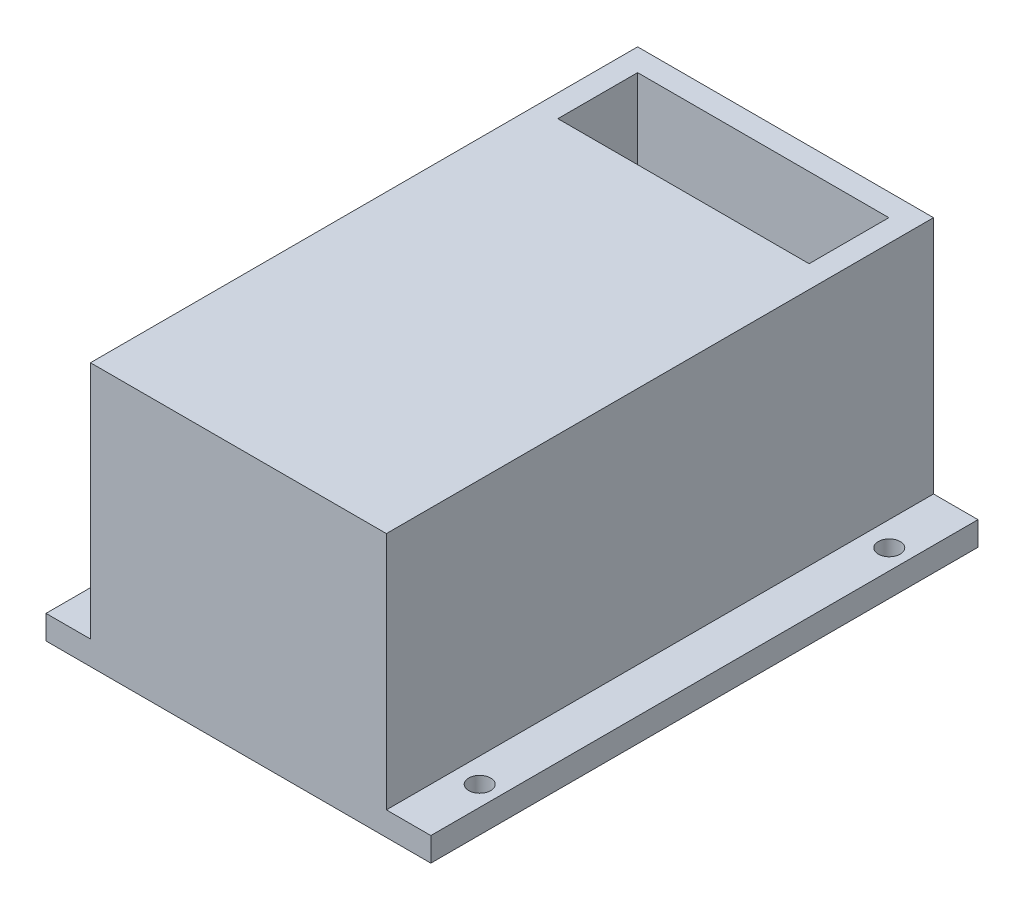
ISO-10303-21;
HEADER;
FILE_DESCRIPTION(('STEP AP214'),'2;1');
FILE_NAME('part.step','',(''),(''),'','','');
FILE_SCHEMA(('AUTOMOTIVE_DESIGN { 1 0 10303 214 1 1 1 1 }'));
ENDSEC;
DATA;
#1=APPLICATION_CONTEXT('core data for automotive mechanical design processes');
#2=APPLICATION_PROTOCOL_DEFINITION('international standard','automotive_design',2000,#1);
#3=PRODUCT_CONTEXT('',#1,'mechanical');
#4=PRODUCT('Part','Part','',(#3));
#5=PRODUCT_RELATED_PRODUCT_CATEGORY('part','',(#4));
#6=PRODUCT_DEFINITION_FORMATION('','',#4);
#7=PRODUCT_DEFINITION_CONTEXT('part definition',#1,'design');
#8=PRODUCT_DEFINITION('design','',#6,#7);
#9=PRODUCT_DEFINITION_SHAPE('','',#8);
#10=(LENGTH_UNIT() NAMED_UNIT(*) SI_UNIT(.MILLI.,.METRE.));
#11=(NAMED_UNIT(*) PLANE_ANGLE_UNIT() SI_UNIT($,.RADIAN.));
#12=(NAMED_UNIT(*) SI_UNIT($,.STERADIAN.) SOLID_ANGLE_UNIT());
#13=UNCERTAINTY_MEASURE_WITH_UNIT(LENGTH_MEASURE(1.E-05),#10,'distance_accuracy_value','');
#14=(GEOMETRIC_REPRESENTATION_CONTEXT(3) GLOBAL_UNCERTAINTY_ASSIGNED_CONTEXT((#13)) GLOBAL_UNIT_ASSIGNED_CONTEXT((#10,
#11,#12)) REPRESENTATION_CONTEXT('',''));
#15=CARTESIAN_POINT('',(0.,0.,0.));
#16=DIRECTION('',(0.,0.,1.));
#17=DIRECTION('',(1.,0.,0.));
#18=AXIS2_PLACEMENT_3D('',#15,#16,#17);
#19=CARTESIAN_POINT('',(0.,30.,0.));
#20=DIRECTION('',(0.,1.,0.));
#21=DIRECTION('',(0.,0.,1.));
#22=AXIS2_PLACEMENT_3D('',#19,#20,#21);
#23=PLANE('',#22);
#24=DIRECTION('',(-1.,0.,0.));
#25=VECTOR('',#24,1.);
#26=CARTESIAN_POINT('',(0.,30.,-53.));
#27=LINE('',#26,#25);
#28=CARTESIAN_POINT('',(31.5,30.,-53.));
#29=VERTEX_POINT('',#28);
#30=CARTESIAN_POINT('',(0.,30.,-53.));
#31=VERTEX_POINT('',#30);
#32=EDGE_CURVE('E218',#29,#31,#27,.T.);
#33=ORIENTED_EDGE('',*,*,#32,.F.);
#34=DIRECTION('',(0.,0.,-1.));
#35=VECTOR('',#34,1.);
#36=CARTESIAN_POINT('',(31.5,30.,0.));
#37=LINE('',#36,#35);
#38=CARTESIAN_POINT('',(31.5,30.,0.));
#39=VERTEX_POINT('',#38);
#40=EDGE_CURVE('E252',#39,#29,#37,.T.);
#41=ORIENTED_EDGE('',*,*,#40,.F.);
#42=DIRECTION('',(1.,0.,0.));
#43=VECTOR('',#42,1.);
#44=CARTESIAN_POINT('',(0.,30.,0.));
#45=LINE('',#44,#43);
#46=CARTESIAN_POINT('',(0.,30.,0.));
#47=VERTEX_POINT('',#46);
#48=EDGE_CURVE('E257',#47,#39,#45,.T.);
#49=ORIENTED_EDGE('',*,*,#48,.F.);
#50=DIRECTION('',(0.,0.,1.));
#51=VECTOR('',#50,1.);
#52=CARTESIAN_POINT('',(0.,30.,0.));
#53=LINE('',#52,#51);
#54=EDGE_CURVE('E236',#31,#47,#53,.T.);
#55=ORIENTED_EDGE('',*,*,#54,.F.);
#56=EDGE_LOOP('',(#33,#41,#49,#55));
#57=FACE_BOUND('',#56,.T.);
#58=ADVANCED_FACE('F41',(#57),#23,.F.);
#59=CARTESIAN_POINT('',(0.,0.,0.));
#60=DIRECTION('',(0.,1.,0.));
#61=DIRECTION('',(0.,0.,1.));
#62=AXIS2_PLACEMENT_3D('',#59,#60,#61);
#63=PLANE('',#62);
#64=DIRECTION('',(-1.,0.,0.));
#65=VECTOR('',#64,1.);
#66=CARTESIAN_POINT('',(34.3,0.,-65.8));
#67=LINE('',#66,#65);
#68=CARTESIAN_POINT('',(39.875,0.,-65.8));
#69=VERTEX_POINT('',#68);
#70=CARTESIAN_POINT('',(-8.37500000000002,0.,-65.8));
#71=VERTEX_POINT('',#70);
#72=EDGE_CURVE('E256',#69,#71,#67,.T.);
#73=ORIENTED_EDGE('',*,*,#72,.F.);
#74=DIRECTION('',(0.,0.,1.));
#75=VECTOR('',#74,1.);
#76=CARTESIAN_POINT('',(39.875,0.,-65.8));
#77=LINE('',#76,#75);
#78=CARTESIAN_POINT('',(39.875,0.,2.8));
#79=VERTEX_POINT('',#78);
#80=EDGE_CURVE('E193',#69,#79,#77,.T.);
#81=ORIENTED_EDGE('',*,*,#80,.T.);
#82=DIRECTION('',(1.,0.,0.));
#83=VECTOR('',#82,1.);
#84=CARTESIAN_POINT('',(-2.8,0.,2.8));
#85=LINE('',#84,#83);
#86=CARTESIAN_POINT('',(-8.37500000000003,0.,2.79999999999998));
#87=VERTEX_POINT('',#86);
#88=EDGE_CURVE('E277',#87,#79,#85,.T.);
#89=ORIENTED_EDGE('',*,*,#88,.F.);
#90=DIRECTION('',(0.,0.,-1.));
#91=VECTOR('',#90,1.);
#92=CARTESIAN_POINT('',(-8.37500000000002,0.,-65.8));
#93=LINE('',#92,#91);
#94=EDGE_CURVE('E151',#87,#71,#93,.T.);
#95=ORIENTED_EDGE('',*,*,#94,.T.);
#96=EDGE_LOOP('',(#73,#81,#89,#95));
#97=FACE_BOUND('',#96,.T.);
#98=DIRECTION('',(0.,0.,1.));
#99=VECTOR('',#98,1.);
#100=CARTESIAN_POINT('',(0.,0.,0.));
#101=LINE('',#100,#99);
#102=CARTESIAN_POINT('',(0.,0.,-63.));
#103=VERTEX_POINT('',#102);
#104=CARTESIAN_POINT('',(0.,0.,0.));
#105=VERTEX_POINT('',#104);
#106=EDGE_CURVE('E248',#103,#105,#101,.T.);
#107=ORIENTED_EDGE('',*,*,#106,.T.);
#108=DIRECTION('',(1.,0.,0.));
#109=VECTOR('',#108,1.);
#110=CARTESIAN_POINT('',(0.,0.,0.));
#111=LINE('',#110,#109);
#112=CARTESIAN_POINT('',(31.5,0.,0.));
#113=VERTEX_POINT('',#112);
#114=EDGE_CURVE('E243',#105,#113,#111,.T.);
#115=ORIENTED_EDGE('',*,*,#114,.T.);
#116=DIRECTION('',(0.,0.,-1.));
#117=VECTOR('',#116,1.);
#118=CARTESIAN_POINT('',(31.5,0.,0.));
#119=LINE('',#118,#117);
#120=CARTESIAN_POINT('',(31.5,0.,-63.));
#121=VERTEX_POINT('',#120);
#122=EDGE_CURVE('E238',#113,#121,#119,.T.);
#123=ORIENTED_EDGE('',*,*,#122,.T.);
#124=DIRECTION('',(-1.,0.,0.));
#125=VECTOR('',#124,1.);
#126=CARTESIAN_POINT('',(0.,0.,-63.));
#127=LINE('',#126,#125);
#128=EDGE_CURVE('E232',#121,#103,#127,.T.);
#129=ORIENTED_EDGE('',*,*,#128,.T.);
#130=EDGE_LOOP('',(#107,#115,#123,#129));
#131=FACE_BOUND('',#130,.T.);
#132=CARTESIAN_POINT('',(37.375,0.,-5.82500000000001));
#133=DIRECTION('',(0.,-1.,0.));
#134=DIRECTION('',(0.,0.,1.));
#135=AXIS2_PLACEMENT_3D('',#132,#133,#134);
#136=CIRCLE('',#135,1.375);
#137=CARTESIAN_POINT('',(37.375,0.,-4.45000000000001));
#138=VERTEX_POINT('',#137);
#139=EDGE_CURVE('E179',#138,#138,#136,.T.);
#140=ORIENTED_EDGE('',*,*,#139,.F.);
#141=EDGE_LOOP('',(#140));
#142=FACE_BOUND('',#141,.T.);
#143=CARTESIAN_POINT('',(37.375,0.,-57.175));
#144=DIRECTION('',(0.,-1.,0.));
#145=DIRECTION('',(0.,0.,-1.));
#146=AXIS2_PLACEMENT_3D('',#143,#144,#145);
#147=CIRCLE('',#146,1.375);
#148=CARTESIAN_POINT('',(37.375,0.,-58.55));
#149=VERTEX_POINT('',#148);
#150=EDGE_CURVE('E185',#149,#149,#147,.T.);
#151=ORIENTED_EDGE('',*,*,#150,.F.);
#152=EDGE_LOOP('',(#151));
#153=FACE_BOUND('',#152,.T.);
#154=CARTESIAN_POINT('',(-5.87499999999999,0.,-57.175));
#155=DIRECTION('',(0.,-1.,0.));
#156=DIRECTION('',(0.,0.,1.));
#157=AXIS2_PLACEMENT_3D('',#154,#155,#156);
#158=CIRCLE('',#157,1.375);
#159=CARTESIAN_POINT('',(-5.87499999999999,0.,-55.8));
#160=VERTEX_POINT('',#159);
#161=EDGE_CURVE('E488',#160,#160,#158,.T.);
#162=ORIENTED_EDGE('',*,*,#161,.F.);
#163=EDGE_LOOP('',(#162));
#164=FACE_BOUND('',#163,.T.);
#165=CARTESIAN_POINT('',(-5.87499999999998,0.,-5.82500000000001));
#166=DIRECTION('',(0.,-1.,0.));
#167=DIRECTION('',(0.,0.,-1.));
#168=AXIS2_PLACEMENT_3D('',#165,#166,#167);
#169=CIRCLE('',#168,1.375);
#170=CARTESIAN_POINT('',(-5.87499999999998,0.,-7.20000000000001));
#171=VERTEX_POINT('',#170);
#172=EDGE_CURVE('E493',#171,#171,#169,.T.);
#173=ORIENTED_EDGE('',*,*,#172,.F.);
#174=EDGE_LOOP('',(#173));
#175=FACE_BOUND('',#174,.T.);
#176=ADVANCED_FACE('F333',(#97,#131,#142,#153,#164,#175),#63,.F.);
#177=CARTESIAN_POINT('',(34.3,33.,-65.8));
#178=DIRECTION('',(0.,0.,1.));
#179=DIRECTION('',(1.,0.,0.));
#180=AXIS2_PLACEMENT_3D('',#177,#178,#179);
#181=PLANE('',#180);
#182=ORIENTED_EDGE('',*,*,#72,.T.);
#183=DIRECTION('',(0.,-1.,0.));
#184=VECTOR('',#183,1.);
#185=CARTESIAN_POINT('',(-8.37500000000002,3.,-65.8));
#186=LINE('',#185,#184);
#187=CARTESIAN_POINT('',(-8.37500000000002,3.,-65.8));
#188=VERTEX_POINT('',#187);
#189=EDGE_CURVE('E154',#188,#71,#186,.T.);
#190=ORIENTED_EDGE('',*,*,#189,.F.);
#191=DIRECTION('',(1.,0.,0.));
#192=VECTOR('',#191,1.);
#193=CARTESIAN_POINT('',(-2.80000000000002,3.,-65.8));
#194=LINE('',#193,#192);
#195=CARTESIAN_POINT('',(-2.80000000000002,3.,-65.8));
#196=VERTEX_POINT('',#195);
#197=EDGE_CURVE('E155',#188,#196,#194,.T.);
#198=ORIENTED_EDGE('',*,*,#197,.T.);
#199=DIRECTION('',(0.,-1.,0.));
#200=VECTOR('',#199,1.);
#201=CARTESIAN_POINT('',(-2.8,33.,-65.8));
#202=LINE('',#201,#200);
#203=CARTESIAN_POINT('',(-2.8,33.,-65.8));
#204=VERTEX_POINT('',#203);
#205=EDGE_CURVE('E300',#204,#196,#202,.T.);
#206=ORIENTED_EDGE('',*,*,#205,.F.);
#207=DIRECTION('',(-1.,0.,0.));
#208=VECTOR('',#207,1.);
#209=CARTESIAN_POINT('',(34.3,33.,-65.8));
#210=LINE('',#209,#208);
#211=CARTESIAN_POINT('',(34.3,33.,-65.8));
#212=VERTEX_POINT('',#211);
#213=EDGE_CURVE('E272',#212,#204,#210,.T.);
#214=ORIENTED_EDGE('',*,*,#213,.F.);
#215=DIRECTION('',(0.,-1.,0.));
#216=VECTOR('',#215,1.);
#217=CARTESIAN_POINT('',(34.3,33.,-65.8));
#218=LINE('',#217,#216);
#219=CARTESIAN_POINT('',(34.3,3.,-65.8));
#220=VERTEX_POINT('',#219);
#221=EDGE_CURVE('E286',#212,#220,#218,.T.);
#222=ORIENTED_EDGE('',*,*,#221,.T.);
#223=DIRECTION('',(1.,0.,0.));
#224=VECTOR('',#223,1.);
#225=CARTESIAN_POINT('',(34.3,3.,-65.8));
#226=LINE('',#225,#224);
#227=CARTESIAN_POINT('',(39.875,3.,-65.8));
#228=VERTEX_POINT('',#227);
#229=EDGE_CURVE('E65',#220,#228,#226,.T.);
#230=ORIENTED_EDGE('',*,*,#229,.T.);
#231=DIRECTION('',(0.,-1.,0.));
#232=VECTOR('',#231,1.);
#233=CARTESIAN_POINT('',(39.875,3.,-65.8));
#234=LINE('',#233,#232);
#235=EDGE_CURVE('E210',#228,#69,#234,.T.);
#236=ORIENTED_EDGE('',*,*,#235,.T.);
#237=EDGE_LOOP('',(#182,#190,#198,#206,#214,#222,#230,#236));
#238=FACE_BOUND('',#237,.T.);
#239=ADVANCED_FACE('F43',(#238),#181,.F.);
#240=CARTESIAN_POINT('',(-2.8,33.,-65.8));
#241=DIRECTION('',(1.,0.,0.));
#242=DIRECTION('',(0.,0.,-1.));
#243=AXIS2_PLACEMENT_3D('',#240,#241,#242);
#244=PLANE('',#243);
#245=ORIENTED_EDGE('',*,*,#205,.T.);
#246=DIRECTION('',(0.,0.,1.));
#247=VECTOR('',#246,1.);
#248=CARTESIAN_POINT('',(-2.80000000000002,3.,-65.8));
#249=LINE('',#248,#247);
#250=CARTESIAN_POINT('',(-2.8,3.,2.8));
#251=VERTEX_POINT('',#250);
#252=EDGE_CURVE('E167',#196,#251,#249,.T.);
#253=ORIENTED_EDGE('',*,*,#252,.T.);
#254=DIRECTION('',(0.,-1.,0.));
#255=VECTOR('',#254,1.);
#256=CARTESIAN_POINT('',(-2.8,33.,2.8));
#257=LINE('',#256,#255);
#258=CARTESIAN_POINT('',(-2.8,33.,2.8));
#259=VERTEX_POINT('',#258);
#260=EDGE_CURVE('E165',#259,#251,#257,.T.);
#261=ORIENTED_EDGE('',*,*,#260,.F.);
#262=DIRECTION('',(0.,0.,1.));
#263=VECTOR('',#262,1.);
#264=CARTESIAN_POINT('',(-2.8,33.,-65.8));
#265=LINE('',#264,#263);
#266=EDGE_CURVE('E276',#204,#259,#265,.T.);
#267=ORIENTED_EDGE('',*,*,#266,.F.);
#268=EDGE_LOOP('',(#245,#253,#261,#267));
#269=FACE_BOUND('',#268,.T.);
#270=ADVANCED_FACE('F364',(#269),#244,.F.);
#271=CARTESIAN_POINT('',(-2.8,33.,2.8));
#272=DIRECTION('',(0.,0.,-1.));
#273=DIRECTION('',(-1.,0.,0.));
#274=AXIS2_PLACEMENT_3D('',#271,#272,#273);
#275=PLANE('',#274);
#276=ORIENTED_EDGE('',*,*,#88,.T.);
#277=DIRECTION('',(0.,-1.,0.));
#278=VECTOR('',#277,1.);
#279=CARTESIAN_POINT('',(39.875,3.,2.8));
#280=LINE('',#279,#278);
#281=CARTESIAN_POINT('',(39.875,3.,2.8));
#282=VERTEX_POINT('',#281);
#283=EDGE_CURVE('E214',#282,#79,#280,.T.);
#284=ORIENTED_EDGE('',*,*,#283,.F.);
#285=DIRECTION('',(-1.,0.,0.));
#286=VECTOR('',#285,1.);
#287=CARTESIAN_POINT('',(34.3,3.,2.8));
#288=LINE('',#287,#286);
#289=CARTESIAN_POINT('',(34.3,3.,2.8));
#290=VERTEX_POINT('',#289);
#291=EDGE_CURVE('E206',#282,#290,#288,.T.);
#292=ORIENTED_EDGE('',*,*,#291,.T.);
#293=DIRECTION('',(0.,-1.,0.));
#294=VECTOR('',#293,1.);
#295=CARTESIAN_POINT('',(34.3,33.,2.8));
#296=LINE('',#295,#294);
#297=CARTESIAN_POINT('',(34.3,33.,2.8));
#298=VERTEX_POINT('',#297);
#299=EDGE_CURVE('E294',#298,#290,#296,.T.);
#300=ORIENTED_EDGE('',*,*,#299,.F.);
#301=DIRECTION('',(1.,0.,0.));
#302=VECTOR('',#301,1.);
#303=CARTESIAN_POINT('',(-2.8,33.,2.8));
#304=LINE('',#303,#302);
#305=EDGE_CURVE('E280',#259,#298,#304,.T.);
#306=ORIENTED_EDGE('',*,*,#305,.F.);
#307=ORIENTED_EDGE('',*,*,#260,.T.);
#308=DIRECTION('',(-1.,0.,0.));
#309=VECTOR('',#308,1.);
#310=CARTESIAN_POINT('',(-2.80000000000003,3.,2.79999999999998));
#311=LINE('',#310,#309);
#312=CARTESIAN_POINT('',(-8.37500000000003,3.,2.79999999999998));
#313=VERTEX_POINT('',#312);
#314=EDGE_CURVE('E57',#251,#313,#311,.T.);
#315=ORIENTED_EDGE('',*,*,#314,.T.);
#316=DIRECTION('',(0.,-1.,0.));
#317=VECTOR('',#316,1.);
#318=CARTESIAN_POINT('',(-8.37500000000003,3.,2.79999999999998));
#319=LINE('',#318,#317);
#320=EDGE_CURVE('E145',#313,#87,#319,.T.);
#321=ORIENTED_EDGE('',*,*,#320,.T.);
#322=EDGE_LOOP('',(#276,#284,#292,#300,#306,#307,#315,#321));
#323=FACE_BOUND('',#322,.T.);
#324=ADVANCED_FACE('F162',(#323),#275,.F.);
#325=CARTESIAN_POINT('',(34.3,33.,2.8));
#326=DIRECTION('',(-1.,0.,0.));
#327=DIRECTION('',(0.,0.,1.));
#328=AXIS2_PLACEMENT_3D('',#325,#326,#327);
#329=PLANE('',#328);
#330=ORIENTED_EDGE('',*,*,#299,.T.);
#331=DIRECTION('',(0.,0.,-1.));
#332=VECTOR('',#331,1.);
#333=CARTESIAN_POINT('',(34.3,3.,-65.8));
#334=LINE('',#333,#332);
#335=EDGE_CURVE('E197',#290,#220,#334,.T.);
#336=ORIENTED_EDGE('',*,*,#335,.T.);
#337=ORIENTED_EDGE('',*,*,#221,.F.);
#338=DIRECTION('',(0.,0.,-1.));
#339=VECTOR('',#338,1.);
#340=CARTESIAN_POINT('',(34.3,33.,2.8));
#341=LINE('',#340,#339);
#342=EDGE_CURVE('E283',#298,#212,#341,.T.);
#343=ORIENTED_EDGE('',*,*,#342,.F.);
#344=EDGE_LOOP('',(#330,#336,#337,#343));
#345=FACE_BOUND('',#344,.T.);
#346=ADVANCED_FACE('F350',(#345),#329,.F.);
#347=CARTESIAN_POINT('',(0.,33.,0.));
#348=DIRECTION('',(0.,1.,0.));
#349=DIRECTION('',(0.,0.,1.));
#350=AXIS2_PLACEMENT_3D('',#347,#348,#349);
#351=PLANE('',#350);
#352=DIRECTION('',(0.,0.,1.));
#353=VECTOR('',#352,1.);
#354=CARTESIAN_POINT('',(0.,33.,0.));
#355=LINE('',#354,#353);
#356=CARTESIAN_POINT('',(0.,33.,-63.));
#357=VERTEX_POINT('',#356);
#358=CARTESIAN_POINT('',(0.,33.,-53.));
#359=VERTEX_POINT('',#358);
#360=EDGE_CURVE('E12',#357,#359,#355,.T.);
#361=ORIENTED_EDGE('',*,*,#360,.F.);
#362=DIRECTION('',(-1.,0.,0.));
#363=VECTOR('',#362,1.);
#364=CARTESIAN_POINT('',(0.,33.,-63.));
#365=LINE('',#364,#363);
#366=CARTESIAN_POINT('',(31.5,33.,-63.));
#367=VERTEX_POINT('',#366);
#368=EDGE_CURVE('E304',#367,#357,#365,.T.);
#369=ORIENTED_EDGE('',*,*,#368,.F.);
#370=DIRECTION('',(0.,0.,-1.));
#371=VECTOR('',#370,1.);
#372=CARTESIAN_POINT('',(31.5,33.,0.));
#373=LINE('',#372,#371);
#374=CARTESIAN_POINT('',(31.5,33.,-53.));
#375=VERTEX_POINT('',#374);
#376=EDGE_CURVE('E308',#375,#367,#373,.T.);
#377=ORIENTED_EDGE('',*,*,#376,.F.);
#378=DIRECTION('',(1.,0.,0.));
#379=VECTOR('',#378,1.);
#380=CARTESIAN_POINT('',(0.,33.,-53.));
#381=LINE('',#380,#379);
#382=EDGE_CURVE('E50',#359,#375,#381,.T.);
#383=ORIENTED_EDGE('',*,*,#382,.F.);
#384=EDGE_LOOP('',(#361,#369,#377,#383));
#385=FACE_BOUND('',#384,.T.);
#386=ORIENTED_EDGE('',*,*,#213,.T.);
#387=ORIENTED_EDGE('',*,*,#266,.T.);
#388=ORIENTED_EDGE('',*,*,#305,.T.);
#389=ORIENTED_EDGE('',*,*,#342,.T.);
#390=EDGE_LOOP('',(#386,#387,#388,#389));
#391=FACE_BOUND('',#390,.T.);
#392=ADVANCED_FACE('F325',(#385,#391),#351,.T.);
#393=CARTESIAN_POINT('',(0.,103.436141291243,0.));
#394=DIRECTION('',(1.,0.,0.));
#395=DIRECTION('',(0.,0.,-1.));
#396=AXIS2_PLACEMENT_3D('',#393,#394,#395);
#397=PLANE('',#396);
#398=DIRECTION('',(0.,-1.,0.));
#399=VECTOR('',#398,1.);
#400=CARTESIAN_POINT('',(0.,103.436141291243,-63.));
#401=LINE('',#400,#399);
#402=EDGE_CURVE('E229',#357,#103,#401,.T.);
#403=ORIENTED_EDGE('',*,*,#402,.F.);
#404=ORIENTED_EDGE('',*,*,#360,.T.);
#405=DIRECTION('',(0.,-1.,0.));
#406=VECTOR('',#405,1.);
#407=CARTESIAN_POINT('',(0.,35.,-53.));
#408=LINE('',#407,#406);
#409=EDGE_CURVE('E226',#359,#31,#408,.T.);
#410=ORIENTED_EDGE('',*,*,#409,.T.);
#411=ORIENTED_EDGE('',*,*,#54,.T.);
#412=DIRECTION('',(0.,-1.,0.));
#413=VECTOR('',#412,1.);
#414=CARTESIAN_POINT('',(0.,103.436141291243,0.));
#415=LINE('',#414,#413);
#416=EDGE_CURVE('E247',#47,#105,#415,.T.);
#417=ORIENTED_EDGE('',*,*,#416,.T.);
#418=ORIENTED_EDGE('',*,*,#106,.F.);
#419=EDGE_LOOP('',(#403,#404,#410,#411,#417,#418));
#420=FACE_BOUND('',#419,.T.);
#421=ADVANCED_FACE('F342',(#420),#397,.T.);
#422=CARTESIAN_POINT('',(0.,103.436141291243,0.));
#423=DIRECTION('',(0.,0.,-1.));
#424=DIRECTION('',(-1.,0.,0.));
#425=AXIS2_PLACEMENT_3D('',#422,#423,#424);
#426=PLANE('',#425);
#427=ORIENTED_EDGE('',*,*,#48,.T.);
#428=DIRECTION('',(0.,-1.,0.));
#429=VECTOR('',#428,1.);
#430=CARTESIAN_POINT('',(31.5,103.436141291243,0.));
#431=LINE('',#430,#429);
#432=EDGE_CURVE('E242',#39,#113,#431,.T.);
#433=ORIENTED_EDGE('',*,*,#432,.T.);
#434=ORIENTED_EDGE('',*,*,#114,.F.);
#435=ORIENTED_EDGE('',*,*,#416,.F.);
#436=EDGE_LOOP('',(#427,#433,#434,#435));
#437=FACE_BOUND('',#436,.T.);
#438=ADVANCED_FACE('F337',(#437),#426,.T.);
#439=CARTESIAN_POINT('',(31.5,103.436141291243,0.));
#440=DIRECTION('',(-1.,0.,0.));
#441=DIRECTION('',(0.,0.,1.));
#442=AXIS2_PLACEMENT_3D('',#439,#440,#441);
#443=PLANE('',#442);
#444=ORIENTED_EDGE('',*,*,#40,.T.);
#445=DIRECTION('',(0.,-1.,0.));
#446=VECTOR('',#445,1.);
#447=CARTESIAN_POINT('',(31.5,35.,-53.));
#448=LINE('',#447,#446);
#449=EDGE_CURVE('E225',#375,#29,#448,.T.);
#450=ORIENTED_EDGE('',*,*,#449,.F.);
#451=ORIENTED_EDGE('',*,*,#376,.T.);
#452=DIRECTION('',(0.,-1.,0.));
#453=VECTOR('',#452,1.);
#454=CARTESIAN_POINT('',(31.5,103.436141291243,-63.));
#455=LINE('',#454,#453);
#456=EDGE_CURVE('E237',#367,#121,#455,.T.);
#457=ORIENTED_EDGE('',*,*,#456,.T.);
#458=ORIENTED_EDGE('',*,*,#122,.F.);
#459=ORIENTED_EDGE('',*,*,#432,.F.);
#460=EDGE_LOOP('',(#444,#450,#451,#457,#458,#459));
#461=FACE_BOUND('',#460,.T.);
#462=ADVANCED_FACE('F322',(#461),#443,.T.);
#463=CARTESIAN_POINT('',(0.,103.436141291243,-63.));
#464=DIRECTION('',(0.,0.,1.));
#465=DIRECTION('',(1.,0.,0.));
#466=AXIS2_PLACEMENT_3D('',#463,#464,#465);
#467=PLANE('',#466);
#468=ORIENTED_EDGE('',*,*,#456,.F.);
#469=ORIENTED_EDGE('',*,*,#368,.T.);
#470=ORIENTED_EDGE('',*,*,#402,.T.);
#471=ORIENTED_EDGE('',*,*,#128,.F.);
#472=EDGE_LOOP('',(#468,#469,#470,#471));
#473=FACE_BOUND('',#472,.T.);
#474=ADVANCED_FACE('F328',(#473),#467,.T.);
#475=CARTESIAN_POINT('',(0.,35.,-53.));
#476=DIRECTION('',(0.,0.,1.));
#477=DIRECTION('',(1.,0.,0.));
#478=AXIS2_PLACEMENT_3D('',#475,#476,#477);
#479=PLANE('',#478);
#480=ORIENTED_EDGE('',*,*,#382,.T.);
#481=ORIENTED_EDGE('',*,*,#449,.T.);
#482=ORIENTED_EDGE('',*,*,#32,.T.);
#483=ORIENTED_EDGE('',*,*,#409,.F.);
#484=EDGE_LOOP('',(#480,#481,#482,#483));
#485=FACE_BOUND('',#484,.T.);
#486=ADVANCED_FACE('F316',(#485),#479,.F.);
#487=CARTESIAN_POINT('',(39.875,3.,-65.8));
#488=DIRECTION('',(1.,0.,0.));
#489=DIRECTION('',(0.,0.,-1.));
#490=AXIS2_PLACEMENT_3D('',#487,#488,#489);
#491=PLANE('',#490);
#492=ORIENTED_EDGE('',*,*,#80,.F.);
#493=ORIENTED_EDGE('',*,*,#235,.F.);
#494=DIRECTION('',(0.,0.,1.));
#495=VECTOR('',#494,1.);
#496=CARTESIAN_POINT('',(39.875,3.,-65.8));
#497=LINE('',#496,#495);
#498=EDGE_CURVE('E202',#228,#282,#497,.T.);
#499=ORIENTED_EDGE('',*,*,#498,.T.);
#500=ORIENTED_EDGE('',*,*,#283,.T.);
#501=EDGE_LOOP('',(#492,#493,#499,#500));
#502=FACE_BOUND('',#501,.T.);
#503=ADVANCED_FACE('F375',(#502),#491,.T.);
#504=CARTESIAN_POINT('',(0.,3.,0.));
#505=DIRECTION('',(0.,1.,0.));
#506=DIRECTION('',(0.,0.,1.));
#507=AXIS2_PLACEMENT_3D('',#504,#505,#506);
#508=PLANE('',#507);
#509=CARTESIAN_POINT('',(37.375,3.,-5.82500000000001));
#510=DIRECTION('',(0.,-1.,0.));
#511=DIRECTION('',(0.,0.,1.));
#512=AXIS2_PLACEMENT_3D('',#509,#510,#511);
#513=CIRCLE('',#512,1.375);
#514=CARTESIAN_POINT('',(37.375,3.,-4.45000000000001));
#515=VERTEX_POINT('',#514);
#516=EDGE_CURVE('E181',#515,#515,#513,.T.);
#517=ORIENTED_EDGE('',*,*,#516,.T.);
#518=EDGE_LOOP('',(#517));
#519=FACE_BOUND('',#518,.T.);
#520=CARTESIAN_POINT('',(37.375,3.,-57.175));
#521=DIRECTION('',(0.,-1.,0.));
#522=DIRECTION('',(0.,0.,-1.));
#523=AXIS2_PLACEMENT_3D('',#520,#521,#522);
#524=CIRCLE('',#523,1.375);
#525=CARTESIAN_POINT('',(37.375,3.,-58.55));
#526=VERTEX_POINT('',#525);
#527=EDGE_CURVE('E189',#526,#526,#524,.T.);
#528=ORIENTED_EDGE('',*,*,#527,.T.);
#529=EDGE_LOOP('',(#528));
#530=FACE_BOUND('',#529,.T.);
#531=ORIENTED_EDGE('',*,*,#335,.F.);
#532=ORIENTED_EDGE('',*,*,#291,.F.);
#533=ORIENTED_EDGE('',*,*,#498,.F.);
#534=ORIENTED_EDGE('',*,*,#229,.F.);
#535=EDGE_LOOP('',(#531,#532,#533,#534));
#536=FACE_BOUND('',#535,.T.);
#537=ADVANCED_FACE('F377',(#519,#530,#536),#508,.T.);
#538=CARTESIAN_POINT('',(37.375,3.,-57.175));
#539=DIRECTION('',(0.,-1.,0.));
#540=DIRECTION('',(0.,0.,-1.));
#541=AXIS2_PLACEMENT_3D('',#538,#539,#540);
#542=CYLINDRICAL_SURFACE('',#541,1.375);
#543=ORIENTED_EDGE('',*,*,#527,.F.);
#544=EDGE_LOOP('',(#543));
#545=FACE_BOUND('',#544,.T.);
#546=ORIENTED_EDGE('',*,*,#150,.T.);
#547=EDGE_LOOP('',(#546));
#548=FACE_BOUND('',#547,.T.);
#549=ADVANCED_FACE('F382',(#545,#548),#542,.F.);
#550=CARTESIAN_POINT('',(37.375,3.,-5.82500000000001));
#551=DIRECTION('',(0.,-1.,0.));
#552=DIRECTION('',(0.,0.,-1.));
#553=AXIS2_PLACEMENT_3D('',#550,#551,#552);
#554=CYLINDRICAL_SURFACE('',#553,1.375);
#555=ORIENTED_EDGE('',*,*,#516,.F.);
#556=EDGE_LOOP('',(#555));
#557=FACE_BOUND('',#556,.T.);
#558=ORIENTED_EDGE('',*,*,#139,.T.);
#559=EDGE_LOOP('',(#558));
#560=FACE_BOUND('',#559,.T.);
#561=ADVANCED_FACE('F389',(#557,#560),#554,.F.);
#562=CARTESIAN_POINT('',(-8.37500000000002,3.,-65.8));
#563=DIRECTION('',(-1.,0.,0.));
#564=DIRECTION('',(0.,0.,1.));
#565=AXIS2_PLACEMENT_3D('',#562,#563,#564);
#566=PLANE('',#565);
#567=ORIENTED_EDGE('',*,*,#94,.F.);
#568=ORIENTED_EDGE('',*,*,#320,.F.);
#569=DIRECTION('',(0.,0.,-1.));
#570=VECTOR('',#569,1.);
#571=CARTESIAN_POINT('',(-8.37500000000002,3.,-65.8));
#572=LINE('',#571,#570);
#573=EDGE_CURVE('E148',#313,#188,#572,.T.);
#574=ORIENTED_EDGE('',*,*,#573,.T.);
#575=ORIENTED_EDGE('',*,*,#189,.T.);
#576=EDGE_LOOP('',(#567,#568,#574,#575));
#577=FACE_BOUND('',#576,.T.);
#578=ADVANCED_FACE('F146',(#577),#566,.T.);
#579=CARTESIAN_POINT('',(0.,3.,0.));
#580=DIRECTION('',(0.,-1.,0.));
#581=DIRECTION('',(0.,0.,-1.));
#582=AXIS2_PLACEMENT_3D('',#579,#580,#581);
#583=PLANE('',#582);
#584=CARTESIAN_POINT('',(-5.87499999999999,3.,-57.175));
#585=DIRECTION('',(0.,-1.,0.));
#586=DIRECTION('',(0.,0.,1.));
#587=AXIS2_PLACEMENT_3D('',#584,#585,#586);
#588=CIRCLE('',#587,1.375);
#589=CARTESIAN_POINT('',(-5.87499999999999,3.,-55.8));
#590=VERTEX_POINT('',#589);
#591=EDGE_CURVE('E485',#590,#590,#588,.T.);
#592=ORIENTED_EDGE('',*,*,#591,.T.);
#593=EDGE_LOOP('',(#592));
#594=FACE_BOUND('',#593,.T.);
#595=CARTESIAN_POINT('',(-5.87499999999998,3.,-5.82500000000001));
#596=DIRECTION('',(0.,-1.,0.));
#597=DIRECTION('',(0.,0.,-1.));
#598=AXIS2_PLACEMENT_3D('',#595,#596,#597);
#599=CIRCLE('',#598,1.375);
#600=CARTESIAN_POINT('',(-5.87499999999998,3.,-7.20000000000001));
#601=VERTEX_POINT('',#600);
#602=EDGE_CURVE('E177',#601,#601,#599,.T.);
#603=ORIENTED_EDGE('',*,*,#602,.T.);
#604=EDGE_LOOP('',(#603));
#605=FACE_BOUND('',#604,.T.);
#606=ORIENTED_EDGE('',*,*,#252,.F.);
#607=ORIENTED_EDGE('',*,*,#197,.F.);
#608=ORIENTED_EDGE('',*,*,#573,.F.);
#609=ORIENTED_EDGE('',*,*,#314,.F.);
#610=EDGE_LOOP('',(#606,#607,#608,#609));
#611=FACE_BOUND('',#610,.T.);
#612=ADVANCED_FACE('F157',(#594,#605,#611),#583,.F.);
#613=CARTESIAN_POINT('',(-5.87499999999998,3.,-5.82500000000001));
#614=DIRECTION('',(0.,-1.,0.));
#615=DIRECTION('',(0.,0.,-1.));
#616=AXIS2_PLACEMENT_3D('',#613,#614,#615);
#617=CYLINDRICAL_SURFACE('',#616,1.375);
#618=ORIENTED_EDGE('',*,*,#602,.F.);
#619=EDGE_LOOP('',(#618));
#620=FACE_BOUND('',#619,.T.);
#621=ORIENTED_EDGE('',*,*,#172,.T.);
#622=EDGE_LOOP('',(#621));
#623=FACE_BOUND('',#622,.T.);
#624=ADVANCED_FACE('F458',(#620,#623),#617,.F.);
#625=CARTESIAN_POINT('',(-5.87499999999999,3.,-57.175));
#626=DIRECTION('',(0.,-1.,0.));
#627=DIRECTION('',(0.,0.,-1.));
#628=AXIS2_PLACEMENT_3D('',#625,#626,#627);
#629=CYLINDRICAL_SURFACE('',#628,1.375);
#630=ORIENTED_EDGE('',*,*,#591,.F.);
#631=EDGE_LOOP('',(#630));
#632=FACE_BOUND('',#631,.T.);
#633=ORIENTED_EDGE('',*,*,#161,.T.);
#634=EDGE_LOOP('',(#633));
#635=FACE_BOUND('',#634,.T.);
#636=ADVANCED_FACE('F468',(#632,#635),#629,.F.);
#637=CLOSED_SHELL('',(#58,#176,#239,#270,#324,#346,#392,#421,#438,#462,#474,#486,#503,#537,#549,
#561,#578,#612,#624,#636));
#638=MANIFOLD_SOLID_BREP('B2',#637);
#639=ADVANCED_BREP_SHAPE_REPRESENTATION('',(#18,#638),#14);
#640=SHAPE_DEFINITION_REPRESENTATION(#9,#639);
ENDSEC;
END-ISO-10303-21;
